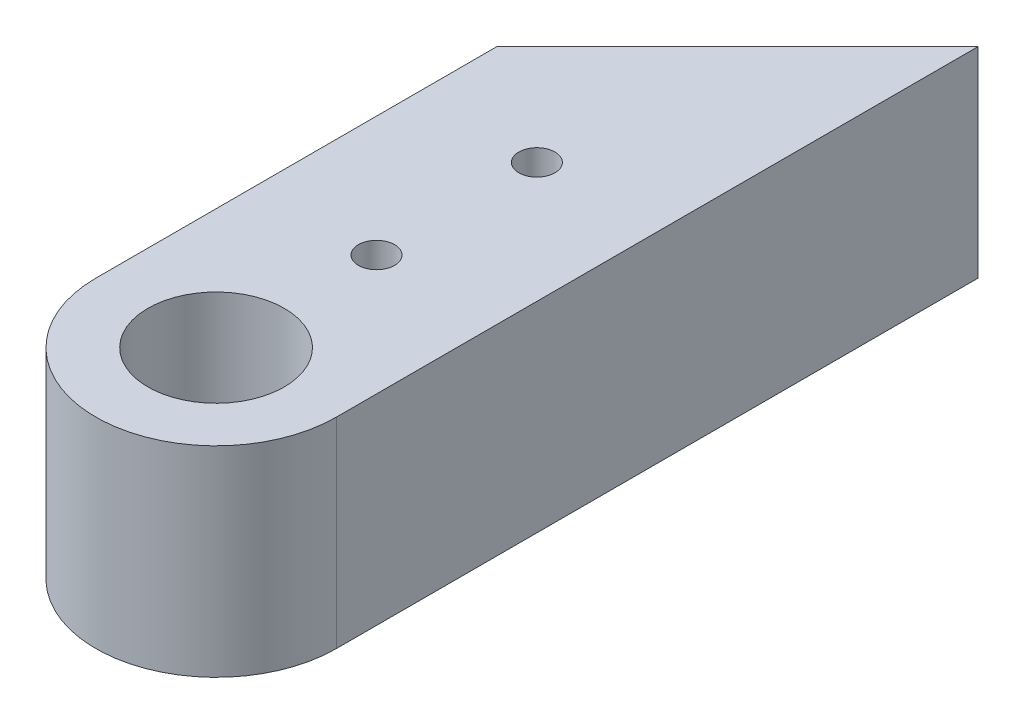
ISO-10303-21;
HEADER;
FILE_DESCRIPTION(('STEP AP214'),'2;1');
FILE_NAME('part.step','',(''),(''),'','','');
FILE_SCHEMA(('AUTOMOTIVE_DESIGN { 1 0 10303 214 1 1 1 1 }'));
ENDSEC;
DATA;
#1=APPLICATION_CONTEXT('core data for automotive mechanical design processes');
#2=APPLICATION_PROTOCOL_DEFINITION('international standard','automotive_design',2000,#1);
#3=PRODUCT_CONTEXT('',#1,'mechanical');
#4=PRODUCT('Part','Part','',(#3));
#5=PRODUCT_RELATED_PRODUCT_CATEGORY('part','',(#4));
#6=PRODUCT_DEFINITION_FORMATION('','',#4);
#7=PRODUCT_DEFINITION_CONTEXT('part definition',#1,'design');
#8=PRODUCT_DEFINITION('design','',#6,#7);
#9=PRODUCT_DEFINITION_SHAPE('','',#8);
#10=(LENGTH_UNIT() NAMED_UNIT(*) SI_UNIT(.MILLI.,.METRE.));
#11=(NAMED_UNIT(*) PLANE_ANGLE_UNIT() SI_UNIT($,.RADIAN.));
#12=(NAMED_UNIT(*) SI_UNIT($,.STERADIAN.) SOLID_ANGLE_UNIT());
#13=UNCERTAINTY_MEASURE_WITH_UNIT(LENGTH_MEASURE(1.E-05),#10,'distance_accuracy_value','');
#14=(GEOMETRIC_REPRESENTATION_CONTEXT(3) GLOBAL_UNCERTAINTY_ASSIGNED_CONTEXT((#13)) GLOBAL_UNIT_ASSIGNED_CONTEXT((#10,
#11,#12)) REPRESENTATION_CONTEXT('',''));
#15=CARTESIAN_POINT('',(0.,0.,0.));
#16=DIRECTION('',(0.,0.,1.));
#17=DIRECTION('',(1.,0.,0.));
#18=AXIS2_PLACEMENT_3D('',#15,#16,#17);
#19=CARTESIAN_POINT('',(0.,25.,0.));
#20=DIRECTION('',(0.,1.,0.));
#21=DIRECTION('',(0.,0.,-1.));
#22=AXIS2_PLACEMENT_3D('',#19,#20,#21);
#23=PLANE('',#22);
#24=CARTESIAN_POINT('',(0.,25.,-20.));
#25=DIRECTION('',(0.,-1.,0.));
#26=DIRECTION('',(0.,0.,-1.));
#27=AXIS2_PLACEMENT_3D('',#24,#25,#26);
#28=CIRCLE('',#27,2.25);
#29=CARTESIAN_POINT('',(0.,25.,-22.25));
#30=VERTEX_POINT('',#29);
#31=EDGE_CURVE('E114',#30,#30,#28,.T.);
#32=ORIENTED_EDGE('',*,*,#31,.T.);
#33=EDGE_LOOP('',(#32));
#34=FACE_BOUND('',#33,.T.);
#35=CARTESIAN_POINT('',(0.,25.,0.));
#36=DIRECTION('',(0.,-1.,0.));
#37=DIRECTION('',(0.,0.,-1.));
#38=AXIS2_PLACEMENT_3D('',#35,#36,#37);
#39=CIRCLE('',#38,15.);
#40=CARTESIAN_POINT('',(15.,25.,0.));
#41=VERTEX_POINT('',#40);
#42=CARTESIAN_POINT('',(-15.,25.,0.));
#43=VERTEX_POINT('',#42);
#44=EDGE_CURVE('E91',#41,#43,#39,.T.);
#45=ORIENTED_EDGE('',*,*,#44,.F.);
#46=DIRECTION('',(0.,0.,1.));
#47=VECTOR('',#46,1.);
#48=CARTESIAN_POINT('',(15.,25.,-79.9999999999993));
#49=LINE('',#48,#47);
#50=CARTESIAN_POINT('',(15.,25.,-79.9999999999993));
#51=VERTEX_POINT('',#50);
#52=EDGE_CURVE('E94',#51,#41,#49,.T.);
#53=ORIENTED_EDGE('',*,*,#52,.F.);
#54=DIRECTION('',(0.707106781186556,0.,-0.707106781186539));
#55=VECTOR('',#54,1.);
#56=CARTESIAN_POINT('',(-15.,25.,-50.));
#57=LINE('',#56,#55);
#58=CARTESIAN_POINT('',(-15.,25.,-50.));
#59=VERTEX_POINT('',#58);
#60=EDGE_CURVE('E82',#59,#51,#57,.T.);
#61=ORIENTED_EDGE('',*,*,#60,.F.);
#62=DIRECTION('',(0.,0.,-1.));
#63=VECTOR('',#62,1.);
#64=CARTESIAN_POINT('',(-15.,25.,0.));
#65=LINE('',#64,#63);
#66=EDGE_CURVE('E87',#43,#59,#65,.T.);
#67=ORIENTED_EDGE('',*,*,#66,.F.);
#68=EDGE_LOOP('',(#45,#53,#61,#67));
#69=FACE_BOUND('',#68,.T.);
#70=CARTESIAN_POINT('',(0.,25.,0.));
#71=DIRECTION('',(0.,-1.,0.));
#72=DIRECTION('',(0.,0.,-1.));
#73=AXIS2_PLACEMENT_3D('',#70,#71,#72);
#74=CIRCLE('',#73,8.5);
#75=CARTESIAN_POINT('',(0.,25.,-8.5));
#76=VERTEX_POINT('',#75);
#77=EDGE_CURVE('E103',#76,#76,#74,.T.);
#78=ORIENTED_EDGE('',*,*,#77,.T.);
#79=EDGE_LOOP('',(#78));
#80=FACE_BOUND('',#79,.T.);
#81=CARTESIAN_POINT('',(0.,25.,-40.));
#82=DIRECTION('',(0.,-1.,0.));
#83=DIRECTION('',(0.,0.,-1.));
#84=AXIS2_PLACEMENT_3D('',#81,#82,#83);
#85=CIRCLE('',#84,2.25);
#86=CARTESIAN_POINT('',(0.,25.,-42.25));
#87=VERTEX_POINT('',#86);
#88=EDGE_CURVE('E120',#87,#87,#85,.T.);
#89=ORIENTED_EDGE('',*,*,#88,.T.);
#90=EDGE_LOOP('',(#89));
#91=FACE_BOUND('',#90,.T.);
#92=ADVANCED_FACE('F35',(#34,#69,#80,#91),#23,.T.);
#93=CARTESIAN_POINT('',(0.,0.,0.));
#94=DIRECTION('',(0.,1.,0.));
#95=DIRECTION('',(0.,0.,-1.));
#96=AXIS2_PLACEMENT_3D('',#93,#94,#95);
#97=PLANE('',#96);
#98=CARTESIAN_POINT('',(0.,0.,0.));
#99=DIRECTION('',(0.,-1.,0.));
#100=DIRECTION('',(0.,0.,-1.));
#101=AXIS2_PLACEMENT_3D('',#98,#99,#100);
#102=CIRCLE('',#101,15.);
#103=CARTESIAN_POINT('',(15.,0.,0.));
#104=VERTEX_POINT('',#103);
#105=CARTESIAN_POINT('',(-15.,0.,0.));
#106=VERTEX_POINT('',#105);
#107=EDGE_CURVE('E99',#104,#106,#102,.T.);
#108=ORIENTED_EDGE('',*,*,#107,.T.);
#109=DIRECTION('',(0.,0.,-1.));
#110=VECTOR('',#109,1.);
#111=CARTESIAN_POINT('',(-15.,0.,0.));
#112=LINE('',#111,#110);
#113=CARTESIAN_POINT('',(-15.,0.,-50.));
#114=VERTEX_POINT('',#113);
#115=EDGE_CURVE('E102',#106,#114,#112,.T.);
#116=ORIENTED_EDGE('',*,*,#115,.T.);
#117=DIRECTION('',(0.707106781186556,0.,-0.707106781186539));
#118=VECTOR('',#117,1.);
#119=CARTESIAN_POINT('',(-15.,0.,-50.));
#120=LINE('',#119,#118);
#121=CARTESIAN_POINT('',(15.,0.,-79.9999999999993));
#122=VERTEX_POINT('',#121);
#123=EDGE_CURVE('E85',#114,#122,#120,.T.);
#124=ORIENTED_EDGE('',*,*,#123,.T.);
#125=DIRECTION('',(0.,0.,1.));
#126=VECTOR('',#125,1.);
#127=CARTESIAN_POINT('',(15.,0.,-50.));
#128=LINE('',#127,#126);
#129=EDGE_CURVE('E106',#122,#104,#128,.T.);
#130=ORIENTED_EDGE('',*,*,#129,.T.);
#131=EDGE_LOOP('',(#108,#116,#124,#130));
#132=FACE_BOUND('',#131,.T.);
#133=CARTESIAN_POINT('',(0.,0.,0.));
#134=DIRECTION('',(0.,-1.,0.));
#135=DIRECTION('',(0.,0.,-1.));
#136=AXIS2_PLACEMENT_3D('',#133,#134,#135);
#137=CIRCLE('',#136,8.5);
#138=CARTESIAN_POINT('',(0.,0.,-8.5));
#139=VERTEX_POINT('',#138);
#140=EDGE_CURVE('E111',#139,#139,#137,.T.);
#141=ORIENTED_EDGE('',*,*,#140,.F.);
#142=EDGE_LOOP('',(#141));
#143=FACE_BOUND('',#142,.T.);
#144=CARTESIAN_POINT('',(0.,0.,-20.));
#145=DIRECTION('',(0.,-1.,0.));
#146=DIRECTION('',(0.,0.,-1.));
#147=AXIS2_PLACEMENT_3D('',#144,#145,#146);
#148=CIRCLE('',#147,2.25);
#149=CARTESIAN_POINT('',(0.,0.,-22.25));
#150=VERTEX_POINT('',#149);
#151=EDGE_CURVE('E117',#150,#150,#148,.T.);
#152=ORIENTED_EDGE('',*,*,#151,.F.);
#153=EDGE_LOOP('',(#152));
#154=FACE_BOUND('',#153,.T.);
#155=CARTESIAN_POINT('',(0.,0.,-40.));
#156=DIRECTION('',(0.,-1.,0.));
#157=DIRECTION('',(0.,0.,-1.));
#158=AXIS2_PLACEMENT_3D('',#155,#156,#157);
#159=CIRCLE('',#158,2.25);
#160=CARTESIAN_POINT('',(0.,0.,-42.25));
#161=VERTEX_POINT('',#160);
#162=EDGE_CURVE('E123',#161,#161,#159,.T.);
#163=ORIENTED_EDGE('',*,*,#162,.F.);
#164=EDGE_LOOP('',(#163));
#165=FACE_BOUND('',#164,.T.);
#166=ADVANCED_FACE('F137',(#132,#143,#154,#165),#97,.F.);
#167=CARTESIAN_POINT('',(0.,25.,0.));
#168=DIRECTION('',(0.,-1.,0.));
#169=DIRECTION('',(0.,0.,1.));
#170=AXIS2_PLACEMENT_3D('',#167,#168,#169);
#171=CYLINDRICAL_SURFACE('',#170,15.);
#172=ORIENTED_EDGE('',*,*,#107,.F.);
#173=DIRECTION('',(0.,-1.,0.));
#174=VECTOR('',#173,1.);
#175=CARTESIAN_POINT('',(15.,25.,0.));
#176=LINE('',#175,#174);
#177=EDGE_CURVE('E52',#41,#104,#176,.T.);
#178=ORIENTED_EDGE('',*,*,#177,.F.);
#179=ORIENTED_EDGE('',*,*,#44,.T.);
#180=DIRECTION('',(0.,-1.,0.));
#181=VECTOR('',#180,1.);
#182=CARTESIAN_POINT('',(-15.,25.,0.));
#183=LINE('',#182,#181);
#184=EDGE_CURVE('E11',#43,#106,#183,.T.);
#185=ORIENTED_EDGE('',*,*,#184,.T.);
#186=EDGE_LOOP('',(#172,#178,#179,#185));
#187=FACE_BOUND('',#186,.T.);
#188=ADVANCED_FACE('F37',(#187),#171,.T.);
#189=CARTESIAN_POINT('',(-15.,25.,0.));
#190=DIRECTION('',(1.,0.,0.));
#191=DIRECTION('',(0.,0.,1.));
#192=AXIS2_PLACEMENT_3D('',#189,#190,#191);
#193=PLANE('',#192);
#194=ORIENTED_EDGE('',*,*,#115,.F.);
#195=ORIENTED_EDGE('',*,*,#184,.F.);
#196=ORIENTED_EDGE('',*,*,#66,.T.);
#197=DIRECTION('',(0.,-1.,0.));
#198=VECTOR('',#197,1.);
#199=CARTESIAN_POINT('',(-15.,25.,-50.));
#200=LINE('',#199,#198);
#201=EDGE_CURVE('E44',#59,#114,#200,.T.);
#202=ORIENTED_EDGE('',*,*,#201,.T.);
#203=EDGE_LOOP('',(#194,#195,#196,#202));
#204=FACE_BOUND('',#203,.T.);
#205=ADVANCED_FACE('F88',(#204),#193,.F.);
#206=CARTESIAN_POINT('',(-15.,25.,-50.));
#207=DIRECTION('',(0.707106781186539,0.,0.707106781186556));
#208=DIRECTION('',(-0.707106781186556,0.,0.707106781186539));
#209=AXIS2_PLACEMENT_3D('',#206,#207,#208);
#210=PLANE('',#209);
#211=ORIENTED_EDGE('',*,*,#123,.F.);
#212=ORIENTED_EDGE('',*,*,#201,.F.);
#213=ORIENTED_EDGE('',*,*,#60,.T.);
#214=DIRECTION('',(0.,-1.,0.));
#215=VECTOR('',#214,1.);
#216=CARTESIAN_POINT('',(15.,25.,-79.9999999999993));
#217=LINE('',#216,#215);
#218=EDGE_CURVE('E68',#51,#122,#217,.T.);
#219=ORIENTED_EDGE('',*,*,#218,.T.);
#220=EDGE_LOOP('',(#211,#212,#213,#219));
#221=FACE_BOUND('',#220,.T.);
#222=ADVANCED_FACE('F80',(#221),#210,.F.);
#223=CARTESIAN_POINT('',(15.,25.,-50.));
#224=DIRECTION('',(-1.,0.,0.));
#225=DIRECTION('',(0.,0.,-1.));
#226=AXIS2_PLACEMENT_3D('',#223,#224,#225);
#227=PLANE('',#226);
#228=ORIENTED_EDGE('',*,*,#129,.F.);
#229=ORIENTED_EDGE('',*,*,#218,.F.);
#230=ORIENTED_EDGE('',*,*,#52,.T.);
#231=ORIENTED_EDGE('',*,*,#177,.T.);
#232=EDGE_LOOP('',(#228,#229,#230,#231));
#233=FACE_BOUND('',#232,.T.);
#234=ADVANCED_FACE('F149',(#233),#227,.F.);
#235=CARTESIAN_POINT('',(0.,25.,0.));
#236=DIRECTION('',(0.,-1.,0.));
#237=DIRECTION('',(0.,0.,1.));
#238=AXIS2_PLACEMENT_3D('',#235,#236,#237);
#239=CYLINDRICAL_SURFACE('',#238,8.5);
#240=ORIENTED_EDGE('',*,*,#77,.F.);
#241=EDGE_LOOP('',(#240));
#242=FACE_BOUND('',#241,.T.);
#243=ORIENTED_EDGE('',*,*,#140,.T.);
#244=EDGE_LOOP('',(#243));
#245=FACE_BOUND('',#244,.T.);
#246=ADVANCED_FACE('F152',(#242,#245),#239,.F.);
#247=CARTESIAN_POINT('',(0.,25.,-20.));
#248=DIRECTION('',(0.,-1.,0.));
#249=DIRECTION('',(0.,0.,1.));
#250=AXIS2_PLACEMENT_3D('',#247,#248,#249);
#251=CYLINDRICAL_SURFACE('',#250,2.25);
#252=ORIENTED_EDGE('',*,*,#31,.F.);
#253=EDGE_LOOP('',(#252));
#254=FACE_BOUND('',#253,.T.);
#255=ORIENTED_EDGE('',*,*,#151,.T.);
#256=EDGE_LOOP('',(#255));
#257=FACE_BOUND('',#256,.T.);
#258=ADVANCED_FACE('F133',(#254,#257),#251,.F.);
#259=CARTESIAN_POINT('',(0.,25.,-40.));
#260=DIRECTION('',(0.,-1.,0.));
#261=DIRECTION('',(0.,0.,1.));
#262=AXIS2_PLACEMENT_3D('',#259,#260,#261);
#263=CYLINDRICAL_SURFACE('',#262,2.25);
#264=ORIENTED_EDGE('',*,*,#88,.F.);
#265=EDGE_LOOP('',(#264));
#266=FACE_BOUND('',#265,.T.);
#267=ORIENTED_EDGE('',*,*,#162,.T.);
#268=EDGE_LOOP('',(#267));
#269=FACE_BOUND('',#268,.T.);
#270=ADVANCED_FACE('F130',(#266,#269),#263,.F.);
#271=CLOSED_SHELL('',(#92,#166,#188,#205,#222,#234,#246,#258,#270));
#272=MANIFOLD_SOLID_BREP('B2',#271);
#273=ADVANCED_BREP_SHAPE_REPRESENTATION('',(#18,#272),#14);
#274=SHAPE_DEFINITION_REPRESENTATION(#9,#273);
ENDSEC;
END-ISO-10303-21;
